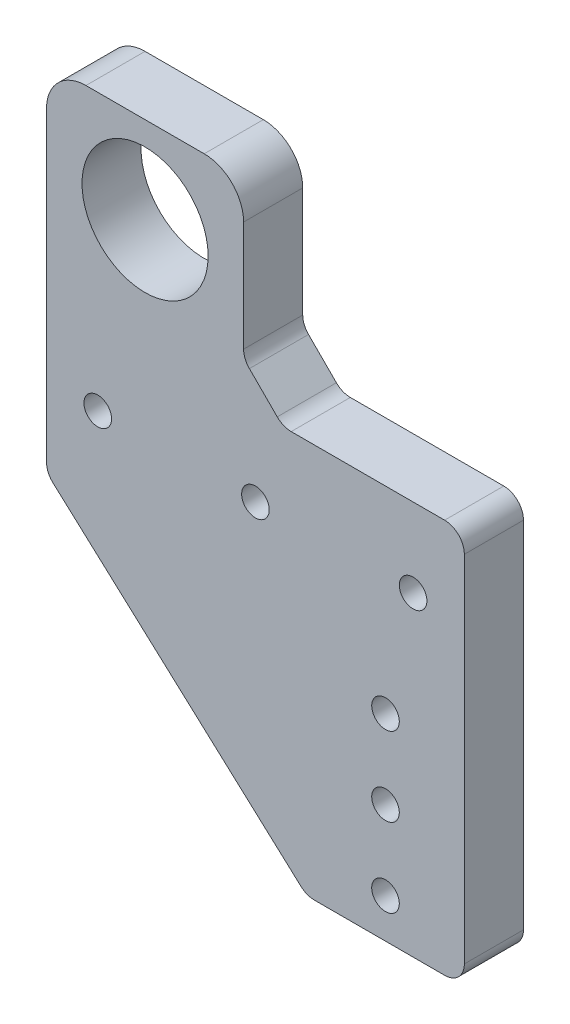
ISO-10303-21;
HEADER;
FILE_DESCRIPTION(('STEP AP214'),'2;1');
FILE_NAME('part.step','',(''),(''),'','','');
FILE_SCHEMA(('AUTOMOTIVE_DESIGN { 1 0 10303 214 1 1 1 1 }'));
ENDSEC;
DATA;
#1=APPLICATION_CONTEXT('core data for automotive mechanical design processes');
#2=APPLICATION_PROTOCOL_DEFINITION('international standard','automotive_design',2000,#1);
#3=PRODUCT_CONTEXT('',#1,'mechanical');
#4=PRODUCT('Part','Part','',(#3));
#5=PRODUCT_RELATED_PRODUCT_CATEGORY('part','',(#4));
#6=PRODUCT_DEFINITION_FORMATION('','',#4);
#7=PRODUCT_DEFINITION_CONTEXT('part definition',#1,'design');
#8=PRODUCT_DEFINITION('design','',#6,#7);
#9=PRODUCT_DEFINITION_SHAPE('','',#8);
#10=(LENGTH_UNIT() NAMED_UNIT(*) SI_UNIT(.MILLI.,.METRE.));
#11=(NAMED_UNIT(*) PLANE_ANGLE_UNIT() SI_UNIT($,.RADIAN.));
#12=(NAMED_UNIT(*) SI_UNIT($,.STERADIAN.) SOLID_ANGLE_UNIT());
#13=UNCERTAINTY_MEASURE_WITH_UNIT(LENGTH_MEASURE(1.E-05),#10,'distance_accuracy_value','');
#14=(GEOMETRIC_REPRESENTATION_CONTEXT(3) GLOBAL_UNCERTAINTY_ASSIGNED_CONTEXT((#13)) GLOBAL_UNIT_ASSIGNED_CONTEXT((#10,
#11,#12)) REPRESENTATION_CONTEXT('',''));
#15=CARTESIAN_POINT('',(0.,0.,0.));
#16=DIRECTION('',(0.,0.,1.));
#17=DIRECTION('',(1.,0.,0.));
#18=AXIS2_PLACEMENT_3D('',#15,#16,#17);
#19=CARTESIAN_POINT('',(-40.,0.,15.));
#20=DIRECTION('',(0.,1.,0.));
#21=DIRECTION('',(0.,0.,1.));
#22=AXIS2_PLACEMENT_3D('',#19,#20,#21);
#23=PLANE('',#22);
#24=DIRECTION('',(1.,0.,0.));
#25=VECTOR('',#24,1.);
#26=CARTESIAN_POINT('',(-40.,0.,0.));
#27=LINE('',#26,#25);
#28=CARTESIAN_POINT('',(-38.0669656263408,0.,0.));
#29=VERTEX_POINT('',#28);
#30=CARTESIAN_POINT('',(-5.,0.,0.));
#31=VERTEX_POINT('',#30);
#32=EDGE_CURVE('E266',#29,#31,#27,.T.);
#33=ORIENTED_EDGE('',*,*,#32,.T.);
#34=DIRECTION('',(0.,0.,-1.));
#35=VECTOR('',#34,1.);
#36=CARTESIAN_POINT('',(-5.,0.,15.));
#37=LINE('',#36,#35);
#38=CARTESIAN_POINT('',(-5.,0.,15.));
#39=VERTEX_POINT('',#38);
#40=EDGE_CURVE('E213',#31,#39,#37,.F.);
#41=ORIENTED_EDGE('',*,*,#40,.T.);
#42=DIRECTION('',(1.,0.,0.));
#43=VECTOR('',#42,1.);
#44=CARTESIAN_POINT('',(-40.,0.,15.));
#45=LINE('',#44,#43);
#46=CARTESIAN_POINT('',(-38.0669656263408,0.,15.));
#47=VERTEX_POINT('',#46);
#48=EDGE_CURVE('E279',#47,#39,#45,.T.);
#49=ORIENTED_EDGE('',*,*,#48,.F.);
#50=DIRECTION('',(0.,0.,-1.));
#51=VECTOR('',#50,1.);
#52=CARTESIAN_POINT('',(-38.0669656263408,0.,15.));
#53=LINE('',#52,#51);
#54=EDGE_CURVE('E210',#47,#29,#53,.T.);
#55=ORIENTED_EDGE('',*,*,#54,.T.);
#56=EDGE_LOOP('',(#33,#41,#49,#55));
#57=FACE_BOUND('',#56,.T.);
#58=ADVANCED_FACE('F33',(#57),#23,.F.);
#59=CARTESIAN_POINT('',(0.,0.,15.));
#60=DIRECTION('',(-1.,0.,0.));
#61=DIRECTION('',(0.,0.,1.));
#62=AXIS2_PLACEMENT_3D('',#59,#60,#61);
#63=PLANE('',#62);
#64=DIRECTION('',(0.,1.,0.));
#65=VECTOR('',#64,1.);
#66=CARTESIAN_POINT('',(0.,0.,0.));
#67=LINE('',#66,#65);
#68=CARTESIAN_POINT('',(0.,5.,0.));
#69=VERTEX_POINT('',#68);
#70=CARTESIAN_POINT('',(0.,95.,0.));
#71=VERTEX_POINT('',#70);
#72=EDGE_CURVE('E269',#69,#71,#67,.T.);
#73=ORIENTED_EDGE('',*,*,#72,.T.);
#74=DIRECTION('',(0.,0.,-1.));
#75=VECTOR('',#74,1.);
#76=CARTESIAN_POINT('',(0.,95.,15.));
#77=LINE('',#76,#75);
#78=CARTESIAN_POINT('',(0.,95.,15.));
#79=VERTEX_POINT('',#78);
#80=EDGE_CURVE('E200',#71,#79,#77,.F.);
#81=ORIENTED_EDGE('',*,*,#80,.T.);
#82=DIRECTION('',(0.,1.,0.));
#83=VECTOR('',#82,1.);
#84=CARTESIAN_POINT('',(0.,0.,15.));
#85=LINE('',#84,#83);
#86=CARTESIAN_POINT('',(0.,5.,15.));
#87=VERTEX_POINT('',#86);
#88=EDGE_CURVE('E262',#87,#79,#85,.T.);
#89=ORIENTED_EDGE('',*,*,#88,.F.);
#90=DIRECTION('',(0.,0.,-1.));
#91=VECTOR('',#90,1.);
#92=CARTESIAN_POINT('',(0.,5.,15.));
#93=LINE('',#92,#91);
#94=EDGE_CURVE('E197',#87,#69,#93,.T.);
#95=ORIENTED_EDGE('',*,*,#94,.T.);
#96=EDGE_LOOP('',(#73,#81,#89,#95));
#97=FACE_BOUND('',#96,.T.);
#98=ADVANCED_FACE('F348',(#97),#63,.F.);
#99=CARTESIAN_POINT('',(0.,100.,15.));
#100=DIRECTION('',(0.,-1.,0.));
#101=DIRECTION('',(0.,0.,-1.));
#102=AXIS2_PLACEMENT_3D('',#99,#100,#101);
#103=PLANE('',#102);
#104=DIRECTION('',(-1.,0.,0.));
#105=VECTOR('',#104,1.);
#106=CARTESIAN_POINT('',(0.,100.,0.));
#107=LINE('',#106,#105);
#108=CARTESIAN_POINT('',(-5.,100.,0.));
#109=VERTEX_POINT('',#108);
#110=CARTESIAN_POINT('',(-43.9289321881345,100.,0.));
#111=VERTEX_POINT('',#110);
#112=EDGE_CURVE('E273',#109,#111,#107,.T.);
#113=ORIENTED_EDGE('',*,*,#112,.T.);
#114=DIRECTION('',(0.,0.,1.));
#115=VECTOR('',#114,1.);
#116=CARTESIAN_POINT('',(-43.9289321881345,100.,15.));
#117=LINE('',#116,#115);
#118=CARTESIAN_POINT('',(-43.9289321881345,100.,15.));
#119=VERTEX_POINT('',#118);
#120=EDGE_CURVE('E185',#111,#119,#117,.T.);
#121=ORIENTED_EDGE('',*,*,#120,.T.);
#122=DIRECTION('',(-1.,0.,0.));
#123=VECTOR('',#122,1.);
#124=CARTESIAN_POINT('',(0.,100.,15.));
#125=LINE('',#124,#123);
#126=CARTESIAN_POINT('',(-5.,100.,15.));
#127=VERTEX_POINT('',#126);
#128=EDGE_CURVE('E257',#127,#119,#125,.T.);
#129=ORIENTED_EDGE('',*,*,#128,.F.);
#130=DIRECTION('',(0.,0.,-1.));
#131=VECTOR('',#130,1.);
#132=CARTESIAN_POINT('',(-5.,100.,15.));
#133=LINE('',#132,#131);
#134=EDGE_CURVE('E182',#127,#109,#133,.T.);
#135=ORIENTED_EDGE('',*,*,#134,.T.);
#136=EDGE_LOOP('',(#113,#121,#129,#135));
#137=FACE_BOUND('',#136,.T.);
#138=ADVANCED_FACE('F354',(#137),#103,.F.);
#139=CARTESIAN_POINT('',(-106.,100.,15.));
#140=DIRECTION('',(1.,0.,0.));
#141=DIRECTION('',(0.,1.,0.));
#142=AXIS2_PLACEMENT_3D('',#139,#140,#141);
#143=PLANE('',#142);
#144=DIRECTION('',(0.,-1.,0.));
#145=VECTOR('',#144,1.);
#146=CARTESIAN_POINT('',(-106.,100.,15.));
#147=LINE('',#146,#145);
#148=CARTESIAN_POINT('',(-106.,140.,15.));
#149=VERTEX_POINT('',#148);
#150=CARTESIAN_POINT('',(-106.,62.2118494305993,15.));
#151=VERTEX_POINT('',#150);
#152=EDGE_CURVE('E252',#149,#151,#147,.T.);
#153=ORIENTED_EDGE('',*,*,#152,.F.);
#154=DIRECTION('',(0.,0.,1.));
#155=VECTOR('',#154,1.);
#156=CARTESIAN_POINT('',(-106.,140.,0.));
#157=LINE('',#156,#155);
#158=CARTESIAN_POINT('',(-106.,140.,0.));
#159=VERTEX_POINT('',#158);
#160=EDGE_CURVE('E56',#149,#159,#157,.F.);
#161=ORIENTED_EDGE('',*,*,#160,.T.);
#162=DIRECTION('',(0.,-1.,0.));
#163=VECTOR('',#162,1.);
#164=CARTESIAN_POINT('',(-106.,100.,0.));
#165=LINE('',#164,#163);
#166=CARTESIAN_POINT('',(-106.,62.2118494305993,0.));
#167=VERTEX_POINT('',#166);
#168=EDGE_CURVE('E241',#159,#167,#165,.T.);
#169=ORIENTED_EDGE('',*,*,#168,.T.);
#170=DIRECTION('',(0.,0.,-1.));
#171=VECTOR('',#170,1.);
#172=CARTESIAN_POINT('',(-106.,62.2118494305993,15.));
#173=LINE('',#172,#171);
#174=EDGE_CURVE('E220',#167,#151,#173,.F.);
#175=ORIENTED_EDGE('',*,*,#174,.T.);
#176=EDGE_LOOP('',(#153,#161,#169,#175));
#177=FACE_BOUND('',#176,.T.);
#178=ADVANCED_FACE('F253',(#177),#143,.F.);
#179=CARTESIAN_POINT('',(-106.,60.,15.));
#180=DIRECTION('',(0.672672793996313,0.739940073395943,0.));
#181=DIRECTION('',(-0.739940073395943,0.672672793996313,0.));
#182=AXIS2_PLACEMENT_3D('',#179,#180,#181);
#183=PLANE('',#182);
#184=DIRECTION('',(0.739940073395943,-0.672672793996313,0.));
#185=VECTOR('',#184,1.);
#186=CARTESIAN_POINT('',(-106.,60.,0.));
#187=LINE('',#186,#185);
#188=CARTESIAN_POINT('',(-104.363363969982,58.5121490636196,0.));
#189=VERTEX_POINT('',#188);
#190=CARTESIAN_POINT('',(-41.4303295963223,1.30029963302029,0.));
#191=VERTEX_POINT('',#190);
#192=EDGE_CURVE('E277',#189,#191,#187,.T.);
#193=ORIENTED_EDGE('',*,*,#192,.T.);
#194=DIRECTION('',(0.,0.,-1.));
#195=VECTOR('',#194,1.);
#196=CARTESIAN_POINT('',(-41.4303295963223,1.30029963302029,15.));
#197=LINE('',#196,#195);
#198=CARTESIAN_POINT('',(-41.4303295963223,1.30029963302029,15.));
#199=VERTEX_POINT('',#198);
#200=EDGE_CURVE('E218',#191,#199,#197,.F.);
#201=ORIENTED_EDGE('',*,*,#200,.T.);
#202=DIRECTION('',(0.739940073395943,-0.672672793996313,0.));
#203=VECTOR('',#202,1.);
#204=CARTESIAN_POINT('',(-106.,60.,15.));
#205=LINE('',#204,#203);
#206=CARTESIAN_POINT('',(-104.363363969982,58.5121490636196,15.));
#207=VERTEX_POINT('',#206);
#208=EDGE_CURVE('E256',#207,#199,#205,.T.);
#209=ORIENTED_EDGE('',*,*,#208,.F.);
#210=DIRECTION('',(0.,0.,-1.));
#211=VECTOR('',#210,1.);
#212=CARTESIAN_POINT('',(-104.363363969982,58.5121490636196,15.));
#213=LINE('',#212,#211);
#214=EDGE_CURVE('E215',#207,#189,#213,.T.);
#215=ORIENTED_EDGE('',*,*,#214,.T.);
#216=EDGE_LOOP('',(#193,#201,#209,#215));
#217=FACE_BOUND('',#216,.T.);
#218=ADVANCED_FACE('F427',(#217),#183,.F.);
#219=CARTESIAN_POINT('',(0.,0.,15.));
#220=DIRECTION('',(0.,0.,1.));
#221=DIRECTION('',(1.,0.,0.));
#222=AXIS2_PLACEMENT_3D('',#219,#220,#221);
#223=PLANE('',#222);
#224=CARTESIAN_POINT('',(-81.,128.,15.));
#225=DIRECTION('',(0.,0.,1.));
#226=DIRECTION('',(1.,0.,0.));
#227=AXIS2_PLACEMENT_3D('',#224,#225,#226);
#228=CIRCLE('',#227,16.);
#229=CARTESIAN_POINT('',(-65.,128.,15.));
#230=VERTEX_POINT('',#229);
#231=EDGE_CURVE('E169',#230,#230,#228,.T.);
#232=ORIENTED_EDGE('',*,*,#231,.F.);
#233=EDGE_LOOP('',(#232));
#234=FACE_BOUND('',#233,.T.);
#235=CARTESIAN_POINT('',(-20.,30.,15.));
#236=DIRECTION('',(0.,0.,1.));
#237=DIRECTION('',(1.,0.,0.));
#238=AXIS2_PLACEMENT_3D('',#235,#236,#237);
#239=CIRCLE('',#238,3.5);
#240=CARTESIAN_POINT('',(-16.5,30.,15.));
#241=VERTEX_POINT('',#240);
#242=EDGE_CURVE('E294',#241,#241,#239,.T.);
#243=ORIENTED_EDGE('',*,*,#242,.F.);
#244=EDGE_LOOP('',(#243));
#245=FACE_BOUND('',#244,.T.);
#246=CARTESIAN_POINT('',(-20.,50.,15.));
#247=DIRECTION('',(0.,0.,1.));
#248=DIRECTION('',(1.,0.,0.));
#249=AXIS2_PLACEMENT_3D('',#246,#247,#248);
#250=CIRCLE('',#249,3.5);
#251=CARTESIAN_POINT('',(-16.5,50.,15.));
#252=VERTEX_POINT('',#251);
#253=EDGE_CURVE('E297',#252,#252,#250,.T.);
#254=ORIENTED_EDGE('',*,*,#253,.F.);
#255=EDGE_LOOP('',(#254));
#256=FACE_BOUND('',#255,.T.);
#257=CARTESIAN_POINT('',(-13.,80.,15.));
#258=DIRECTION('',(0.,0.,1.));
#259=DIRECTION('',(1.,0.,0.));
#260=AXIS2_PLACEMENT_3D('',#257,#258,#259);
#261=CIRCLE('',#260,3.50000000000001);
#262=CARTESIAN_POINT('',(-9.49999999999998,80.,15.));
#263=VERTEX_POINT('',#262);
#264=EDGE_CURVE('E300',#263,#263,#261,.T.);
#265=ORIENTED_EDGE('',*,*,#264,.F.);
#266=EDGE_LOOP('',(#265));
#267=FACE_BOUND('',#266,.T.);
#268=CARTESIAN_POINT('',(-93.,80.,15.));
#269=DIRECTION('',(0.,0.,1.));
#270=DIRECTION('',(1.,0.,0.));
#271=AXIS2_PLACEMENT_3D('',#268,#269,#270);
#272=CIRCLE('',#271,3.50000000000001);
#273=CARTESIAN_POINT('',(-89.5,80.,15.));
#274=VERTEX_POINT('',#273);
#275=EDGE_CURVE('E303',#274,#274,#272,.T.);
#276=ORIENTED_EDGE('',*,*,#275,.F.);
#277=EDGE_LOOP('',(#276));
#278=FACE_BOUND('',#277,.T.);
#279=CARTESIAN_POINT('',(-53.,80.,15.));
#280=DIRECTION('',(0.,0.,1.));
#281=DIRECTION('',(1.,0.,0.));
#282=AXIS2_PLACEMENT_3D('',#279,#280,#281);
#283=CIRCLE('',#282,3.5);
#284=CARTESIAN_POINT('',(-49.5,80.,15.));
#285=VERTEX_POINT('',#284);
#286=EDGE_CURVE('E306',#285,#285,#283,.T.);
#287=ORIENTED_EDGE('',*,*,#286,.F.);
#288=EDGE_LOOP('',(#287));
#289=FACE_BOUND('',#288,.T.);
#290=CARTESIAN_POINT('',(-20.,10.,15.));
#291=DIRECTION('',(0.,0.,1.));
#292=DIRECTION('',(1.,0.,0.));
#293=AXIS2_PLACEMENT_3D('',#290,#291,#292);
#294=CIRCLE('',#293,3.5);
#295=CARTESIAN_POINT('',(-16.5,10.,15.));
#296=VERTEX_POINT('',#295);
#297=EDGE_CURVE('E270',#296,#296,#294,.T.);
#298=ORIENTED_EDGE('',*,*,#297,.F.);
#299=EDGE_LOOP('',(#298));
#300=FACE_BOUND('',#299,.T.);
#301=DIRECTION('',(-1.,0.,0.));
#302=VECTOR('',#301,1.);
#303=CARTESIAN_POINT('',(-106.,150.,15.));
#304=LINE('',#303,#302);
#305=CARTESIAN_POINT('',(-66.,150.,15.));
#306=VERTEX_POINT('',#305);
#307=CARTESIAN_POINT('',(-96.,150.,15.));
#308=VERTEX_POINT('',#307);
#309=EDGE_CURVE('E168',#306,#308,#304,.T.);
#310=ORIENTED_EDGE('',*,*,#309,.T.);
#311=CARTESIAN_POINT('',(-96.,140.,15.));
#312=DIRECTION('',(0.,0.,1.));
#313=DIRECTION('',(1.,0.,0.));
#314=AXIS2_PLACEMENT_3D('',#311,#312,#313);
#315=CIRCLE('',#314,10.);
#316=EDGE_CURVE('E234',#308,#149,#315,.T.);
#317=ORIENTED_EDGE('',*,*,#316,.T.);
#318=ORIENTED_EDGE('',*,*,#152,.T.);
#319=CARTESIAN_POINT('',(-101.,62.2118494305993,15.));
#320=DIRECTION('',(0.,0.,1.));
#321=DIRECTION('',(1.,0.,0.));
#322=AXIS2_PLACEMENT_3D('',#319,#320,#321);
#323=CIRCLE('',#322,5.);
#324=EDGE_CURVE('E202',#151,#207,#323,.T.);
#325=ORIENTED_EDGE('',*,*,#324,.T.);
#326=ORIENTED_EDGE('',*,*,#208,.T.);
#327=CARTESIAN_POINT('',(-38.0669656263408,5.,15.));
#328=DIRECTION('',(0.,0.,1.));
#329=DIRECTION('',(1.,0.,0.));
#330=AXIS2_PLACEMENT_3D('',#327,#328,#329);
#331=CIRCLE('',#330,5.);
#332=EDGE_CURVE('E204',#199,#47,#331,.T.);
#333=ORIENTED_EDGE('',*,*,#332,.T.);
#334=ORIENTED_EDGE('',*,*,#48,.T.);
#335=CARTESIAN_POINT('',(-5.,5.,15.));
#336=DIRECTION('',(0.,0.,1.));
#337=DIRECTION('',(1.,0.,0.));
#338=AXIS2_PLACEMENT_3D('',#335,#336,#337);
#339=CIRCLE('',#338,5.);
#340=EDGE_CURVE('E206',#39,#87,#339,.T.);
#341=ORIENTED_EDGE('',*,*,#340,.T.);
#342=ORIENTED_EDGE('',*,*,#88,.T.);
#343=CARTESIAN_POINT('',(-5.,95.,15.));
#344=DIRECTION('',(0.,0.,1.));
#345=DIRECTION('',(1.,0.,0.));
#346=AXIS2_PLACEMENT_3D('',#343,#344,#345);
#347=CIRCLE('',#346,5.);
#348=EDGE_CURVE('E208',#79,#127,#347,.T.);
#349=ORIENTED_EDGE('',*,*,#348,.T.);
#350=ORIENTED_EDGE('',*,*,#128,.T.);
#351=CARTESIAN_POINT('',(-43.9289321881345,105.,15.));
#352=DIRECTION('',(0.,0.,1.));
#353=DIRECTION('',(1.,0.,0.));
#354=AXIS2_PLACEMENT_3D('',#351,#352,#353);
#355=CIRCLE('',#354,5.);
#356=CARTESIAN_POINT('',(-47.4644660940672,101.464466094067,15.));
#357=VERTEX_POINT('',#356);
#358=EDGE_CURVE('E160',#119,#357,#355,.F.);
#359=ORIENTED_EDGE('',*,*,#358,.T.);
#360=DIRECTION('',(-0.707106781186551,0.707106781186544,0.));
#361=VECTOR('',#360,1.);
#362=CARTESIAN_POINT('',(-45.9999999999999,100.,15.));
#363=LINE('',#362,#361);
#364=CARTESIAN_POINT('',(-54.5355339059327,108.535533905933,15.));
#365=VERTEX_POINT('',#364);
#366=EDGE_CURVE('E156',#357,#365,#363,.T.);
#367=ORIENTED_EDGE('',*,*,#366,.T.);
#368=CARTESIAN_POINT('',(-51.,112.071067811865,15.));
#369=DIRECTION('',(0.,0.,1.));
#370=DIRECTION('',(1.,0.,0.));
#371=AXIS2_PLACEMENT_3D('',#368,#369,#370);
#372=CIRCLE('',#371,5.);
#373=CARTESIAN_POINT('',(-56.,112.071067811865,15.));
#374=VERTEX_POINT('',#373);
#375=EDGE_CURVE('E150',#365,#374,#372,.F.);
#376=ORIENTED_EDGE('',*,*,#375,.T.);
#377=DIRECTION('',(0.,1.,0.));
#378=VECTOR('',#377,1.);
#379=CARTESIAN_POINT('',(-56.,100.,15.));
#380=LINE('',#379,#378);
#381=CARTESIAN_POINT('',(-56.,140.,15.));
#382=VERTEX_POINT('',#381);
#383=EDGE_CURVE('E154',#374,#382,#380,.T.);
#384=ORIENTED_EDGE('',*,*,#383,.T.);
#385=CARTESIAN_POINT('',(-66.,140.,15.));
#386=DIRECTION('',(0.,0.,1.));
#387=DIRECTION('',(1.,0.,0.));
#388=AXIS2_PLACEMENT_3D('',#385,#386,#387);
#389=CIRCLE('',#388,10.);
#390=EDGE_CURVE('E232',#382,#306,#389,.T.);
#391=ORIENTED_EDGE('',*,*,#390,.T.);
#392=EDGE_LOOP('',(#310,#317,#318,#325,#326,#333,#334,#341,#342,#349,#350,#359,#367,#376,#384,#391));
#393=FACE_BOUND('',#392,.T.);
#394=ADVANCED_FACE('F153',(#234,#245,#256,#267,#278,#289,#300,#393),#223,.T.);
#395=CARTESIAN_POINT('',(0.,0.,0.));
#396=DIRECTION('',(0.,0.,1.));
#397=DIRECTION('',(1.,0.,0.));
#398=AXIS2_PLACEMENT_3D('',#395,#396,#397);
#399=PLANE('',#398);
#400=CARTESIAN_POINT('',(-81.,128.,0.));
#401=DIRECTION('',(0.,0.,1.));
#402=DIRECTION('',(1.,0.,0.));
#403=AXIS2_PLACEMENT_3D('',#400,#401,#402);
#404=CIRCLE('',#403,16.);
#405=CARTESIAN_POINT('',(-65.,128.,0.));
#406=VERTEX_POINT('',#405);
#407=EDGE_CURVE('E327',#406,#406,#404,.T.);
#408=ORIENTED_EDGE('',*,*,#407,.T.);
#409=EDGE_LOOP('',(#408));
#410=FACE_BOUND('',#409,.T.);
#411=CARTESIAN_POINT('',(-20.,30.,0.));
#412=DIRECTION('',(0.,0.,1.));
#413=DIRECTION('',(1.,0.,0.));
#414=AXIS2_PLACEMENT_3D('',#411,#412,#413);
#415=CIRCLE('',#414,3.5);
#416=CARTESIAN_POINT('',(-16.5,30.,0.));
#417=VERTEX_POINT('',#416);
#418=EDGE_CURVE('E309',#417,#417,#415,.T.);
#419=ORIENTED_EDGE('',*,*,#418,.T.);
#420=EDGE_LOOP('',(#419));
#421=FACE_BOUND('',#420,.T.);
#422=CARTESIAN_POINT('',(-20.,50.,0.));
#423=DIRECTION('',(0.,0.,1.));
#424=DIRECTION('',(1.,0.,0.));
#425=AXIS2_PLACEMENT_3D('',#422,#423,#424);
#426=CIRCLE('',#425,3.5);
#427=CARTESIAN_POINT('',(-16.5,50.,0.));
#428=VERTEX_POINT('',#427);
#429=EDGE_CURVE('E313',#428,#428,#426,.T.);
#430=ORIENTED_EDGE('',*,*,#429,.T.);
#431=EDGE_LOOP('',(#430));
#432=FACE_BOUND('',#431,.T.);
#433=CARTESIAN_POINT('',(-13.,80.,0.));
#434=DIRECTION('',(0.,0.,1.));
#435=DIRECTION('',(-1.,0.,0.));
#436=AXIS2_PLACEMENT_3D('',#433,#434,#435);
#437=CIRCLE('',#436,3.50000000000001);
#438=CARTESIAN_POINT('',(-16.5,80.,0.));
#439=VERTEX_POINT('',#438);
#440=EDGE_CURVE('E248',#439,#439,#437,.T.);
#441=ORIENTED_EDGE('',*,*,#440,.T.);
#442=EDGE_LOOP('',(#441));
#443=FACE_BOUND('',#442,.T.);
#444=CARTESIAN_POINT('',(-93.,80.,0.));
#445=DIRECTION('',(0.,0.,1.));
#446=DIRECTION('',(1.,0.,0.));
#447=AXIS2_PLACEMENT_3D('',#444,#445,#446);
#448=CIRCLE('',#447,3.50000000000001);
#449=CARTESIAN_POINT('',(-89.5,80.,0.));
#450=VERTEX_POINT('',#449);
#451=EDGE_CURVE('E314',#450,#450,#448,.T.);
#452=ORIENTED_EDGE('',*,*,#451,.T.);
#453=EDGE_LOOP('',(#452));
#454=FACE_BOUND('',#453,.T.);
#455=CARTESIAN_POINT('',(-53.,80.,0.));
#456=DIRECTION('',(0.,0.,1.));
#457=DIRECTION('',(1.,0.,0.));
#458=AXIS2_PLACEMENT_3D('',#455,#456,#457);
#459=CIRCLE('',#458,3.5);
#460=CARTESIAN_POINT('',(-49.5,80.,0.));
#461=VERTEX_POINT('',#460);
#462=EDGE_CURVE('E310',#461,#461,#459,.T.);
#463=ORIENTED_EDGE('',*,*,#462,.T.);
#464=EDGE_LOOP('',(#463));
#465=FACE_BOUND('',#464,.T.);
#466=CARTESIAN_POINT('',(-20.,10.,0.));
#467=DIRECTION('',(0.,0.,1.));
#468=DIRECTION('',(1.,0.,0.));
#469=AXIS2_PLACEMENT_3D('',#466,#467,#468);
#470=CIRCLE('',#469,3.5);
#471=CARTESIAN_POINT('',(-16.5,10.,0.));
#472=VERTEX_POINT('',#471);
#473=EDGE_CURVE('E291',#472,#472,#470,.T.);
#474=ORIENTED_EDGE('',*,*,#473,.T.);
#475=EDGE_LOOP('',(#474));
#476=FACE_BOUND('',#475,.T.);
#477=ORIENTED_EDGE('',*,*,#168,.F.);
#478=CARTESIAN_POINT('',(-96.,140.,0.));
#479=DIRECTION('',(0.,0.,1.));
#480=DIRECTION('',(1.,0.,0.));
#481=AXIS2_PLACEMENT_3D('',#478,#479,#480);
#482=CIRCLE('',#481,10.);
#483=CARTESIAN_POINT('',(-96.,150.,0.));
#484=VERTEX_POINT('',#483);
#485=EDGE_CURVE('E41',#159,#484,#482,.F.);
#486=ORIENTED_EDGE('',*,*,#485,.T.);
#487=DIRECTION('',(-1.,0.,0.));
#488=VECTOR('',#487,1.);
#489=CARTESIAN_POINT('',(-106.,150.,0.));
#490=LINE('',#489,#488);
#491=CARTESIAN_POINT('',(-66.,150.,0.));
#492=VERTEX_POINT('',#491);
#493=EDGE_CURVE('E240',#492,#484,#490,.T.);
#494=ORIENTED_EDGE('',*,*,#493,.F.);
#495=CARTESIAN_POINT('',(-66.,140.,0.));
#496=DIRECTION('',(0.,0.,1.));
#497=DIRECTION('',(1.,0.,0.));
#498=AXIS2_PLACEMENT_3D('',#495,#496,#497);
#499=CIRCLE('',#498,10.);
#500=CARTESIAN_POINT('',(-56.,140.,0.));
#501=VERTEX_POINT('',#500);
#502=EDGE_CURVE('E48',#492,#501,#499,.F.);
#503=ORIENTED_EDGE('',*,*,#502,.T.);
#504=DIRECTION('',(0.,1.,0.));
#505=VECTOR('',#504,1.);
#506=CARTESIAN_POINT('',(-56.,100.,0.));
#507=LINE('',#506,#505);
#508=CARTESIAN_POINT('',(-56.,112.071067811865,0.));
#509=VERTEX_POINT('',#508);
#510=EDGE_CURVE('E249',#509,#501,#507,.T.);
#511=ORIENTED_EDGE('',*,*,#510,.F.);
#512=CARTESIAN_POINT('',(-51.,112.071067811865,0.));
#513=DIRECTION('',(0.,0.,1.));
#514=DIRECTION('',(1.,0.,0.));
#515=AXIS2_PLACEMENT_3D('',#512,#513,#514);
#516=CIRCLE('',#515,5.);
#517=CARTESIAN_POINT('',(-54.5355339059327,108.535533905933,0.));
#518=VERTEX_POINT('',#517);
#519=EDGE_CURVE('E161',#509,#518,#516,.T.);
#520=ORIENTED_EDGE('',*,*,#519,.T.);
#521=DIRECTION('',(0.707106781186551,-0.707106781186544,0.));
#522=VECTOR('',#521,1.);
#523=CARTESIAN_POINT('',(27.0000000000003,27.0000000000006,0.));
#524=LINE('',#523,#522);
#525=CARTESIAN_POINT('',(-47.4644660940672,101.464466094067,0.));
#526=VERTEX_POINT('',#525);
#527=EDGE_CURVE('E173',#518,#526,#524,.T.);
#528=ORIENTED_EDGE('',*,*,#527,.T.);
#529=CARTESIAN_POINT('',(-43.9289321881345,105.,0.));
#530=DIRECTION('',(0.,0.,1.));
#531=DIRECTION('',(1.,0.,0.));
#532=AXIS2_PLACEMENT_3D('',#529,#530,#531);
#533=CIRCLE('',#532,5.);
#534=EDGE_CURVE('E225',#526,#111,#533,.T.);
#535=ORIENTED_EDGE('',*,*,#534,.T.);
#536=ORIENTED_EDGE('',*,*,#112,.F.);
#537=CARTESIAN_POINT('',(-5.,95.,0.));
#538=DIRECTION('',(0.,0.,1.));
#539=DIRECTION('',(1.,0.,0.));
#540=AXIS2_PLACEMENT_3D('',#537,#538,#539);
#541=CIRCLE('',#540,5.);
#542=EDGE_CURVE('E195',#109,#71,#541,.F.);
#543=ORIENTED_EDGE('',*,*,#542,.T.);
#544=ORIENTED_EDGE('',*,*,#72,.F.);
#545=CARTESIAN_POINT('',(-5.,5.,0.));
#546=DIRECTION('',(0.,0.,1.));
#547=DIRECTION('',(1.,0.,0.));
#548=AXIS2_PLACEMENT_3D('',#545,#546,#547);
#549=CIRCLE('',#548,5.);
#550=EDGE_CURVE('E193',#69,#31,#549,.F.);
#551=ORIENTED_EDGE('',*,*,#550,.T.);
#552=ORIENTED_EDGE('',*,*,#32,.F.);
#553=CARTESIAN_POINT('',(-38.0669656263408,5.,0.));
#554=DIRECTION('',(0.,0.,1.));
#555=DIRECTION('',(1.,0.,0.));
#556=AXIS2_PLACEMENT_3D('',#553,#554,#555);
#557=CIRCLE('',#556,5.);
#558=EDGE_CURVE('E191',#29,#191,#557,.F.);
#559=ORIENTED_EDGE('',*,*,#558,.T.);
#560=ORIENTED_EDGE('',*,*,#192,.F.);
#561=CARTESIAN_POINT('',(-101.,62.2118494305993,0.));
#562=DIRECTION('',(0.,0.,1.));
#563=DIRECTION('',(1.,0.,0.));
#564=AXIS2_PLACEMENT_3D('',#561,#562,#563);
#565=CIRCLE('',#564,5.);
#566=EDGE_CURVE('E188',#189,#167,#565,.F.);
#567=ORIENTED_EDGE('',*,*,#566,.T.);
#568=EDGE_LOOP('',(#477,#486,#494,#503,#511,#520,#528,#535,#536,#543,#544,#551,#552,#559,#560,#567));
#569=FACE_BOUND('',#568,.T.);
#570=ADVANCED_FACE('F239',(#410,#421,#432,#443,#454,#465,#476,#569),#399,.F.);
#571=CARTESIAN_POINT('',(-20.,10.,0.));
#572=DIRECTION('',(0.,0.,1.));
#573=DIRECTION('',(1.,0.,0.));
#574=AXIS2_PLACEMENT_3D('',#571,#572,#573);
#575=CYLINDRICAL_SURFACE('',#574,3.5);
#576=ORIENTED_EDGE('',*,*,#297,.T.);
#577=EDGE_LOOP('',(#576));
#578=FACE_BOUND('',#577,.T.);
#579=ORIENTED_EDGE('',*,*,#473,.F.);
#580=EDGE_LOOP('',(#579));
#581=FACE_BOUND('',#580,.T.);
#582=ADVANCED_FACE('F416',(#578,#581),#575,.F.);
#583=CARTESIAN_POINT('',(-53.,80.,0.));
#584=DIRECTION('',(0.,0.,1.));
#585=DIRECTION('',(1.,0.,0.));
#586=AXIS2_PLACEMENT_3D('',#583,#584,#585);
#587=CYLINDRICAL_SURFACE('',#586,3.5);
#588=ORIENTED_EDGE('',*,*,#286,.T.);
#589=EDGE_LOOP('',(#588));
#590=FACE_BOUND('',#589,.T.);
#591=ORIENTED_EDGE('',*,*,#462,.F.);
#592=EDGE_LOOP('',(#591));
#593=FACE_BOUND('',#592,.T.);
#594=ADVANCED_FACE('F546',(#590,#593),#587,.F.);
#595=CARTESIAN_POINT('',(-93.,80.,0.));
#596=DIRECTION('',(0.,0.,1.));
#597=DIRECTION('',(1.,0.,0.));
#598=AXIS2_PLACEMENT_3D('',#595,#596,#597);
#599=CYLINDRICAL_SURFACE('',#598,3.50000000000001);
#600=ORIENTED_EDGE('',*,*,#275,.T.);
#601=EDGE_LOOP('',(#600));
#602=FACE_BOUND('',#601,.T.);
#603=ORIENTED_EDGE('',*,*,#451,.F.);
#604=EDGE_LOOP('',(#603));
#605=FACE_BOUND('',#604,.T.);
#606=ADVANCED_FACE('F536',(#602,#605),#599,.F.);
#607=CARTESIAN_POINT('',(-13.,80.,0.));
#608=DIRECTION('',(0.,0.,1.));
#609=DIRECTION('',(1.,0.,0.));
#610=AXIS2_PLACEMENT_3D('',#607,#608,#609);
#611=CYLINDRICAL_SURFACE('',#610,3.50000000000001);
#612=ORIENTED_EDGE('',*,*,#264,.T.);
#613=EDGE_LOOP('',(#612));
#614=FACE_BOUND('',#613,.T.);
#615=ORIENTED_EDGE('',*,*,#440,.F.);
#616=EDGE_LOOP('',(#615));
#617=FACE_BOUND('',#616,.T.);
#618=ADVANCED_FACE('F526',(#614,#617),#611,.F.);
#619=CARTESIAN_POINT('',(-20.,50.,0.));
#620=DIRECTION('',(0.,0.,1.));
#621=DIRECTION('',(1.,0.,0.));
#622=AXIS2_PLACEMENT_3D('',#619,#620,#621);
#623=CYLINDRICAL_SURFACE('',#622,3.5);
#624=ORIENTED_EDGE('',*,*,#253,.T.);
#625=EDGE_LOOP('',(#624));
#626=FACE_BOUND('',#625,.T.);
#627=ORIENTED_EDGE('',*,*,#429,.F.);
#628=EDGE_LOOP('',(#627));
#629=FACE_BOUND('',#628,.T.);
#630=ADVANCED_FACE('F516',(#626,#629),#623,.F.);
#631=CARTESIAN_POINT('',(-20.,30.,0.));
#632=DIRECTION('',(0.,0.,1.));
#633=DIRECTION('',(1.,0.,0.));
#634=AXIS2_PLACEMENT_3D('',#631,#632,#633);
#635=CYLINDRICAL_SURFACE('',#634,3.5);
#636=ORIENTED_EDGE('',*,*,#242,.T.);
#637=EDGE_LOOP('',(#636));
#638=FACE_BOUND('',#637,.T.);
#639=ORIENTED_EDGE('',*,*,#418,.F.);
#640=EDGE_LOOP('',(#639));
#641=FACE_BOUND('',#640,.T.);
#642=ADVANCED_FACE('F407',(#638,#641),#635,.F.);
#643=CARTESIAN_POINT('',(-106.,150.,0.));
#644=DIRECTION('',(0.,1.,0.));
#645=DIRECTION('',(0.,0.,1.));
#646=AXIS2_PLACEMENT_3D('',#643,#644,#645);
#647=PLANE('',#646);
#648=ORIENTED_EDGE('',*,*,#493,.T.);
#649=DIRECTION('',(0.,0.,1.));
#650=VECTOR('',#649,1.);
#651=CARTESIAN_POINT('',(-96.,150.,15.));
#652=LINE('',#651,#650);
#653=EDGE_CURVE('E229',#484,#308,#652,.T.);
#654=ORIENTED_EDGE('',*,*,#653,.T.);
#655=ORIENTED_EDGE('',*,*,#309,.F.);
#656=DIRECTION('',(0.,0.,1.));
#657=VECTOR('',#656,1.);
#658=CARTESIAN_POINT('',(-66.,150.,0.));
#659=LINE('',#658,#657);
#660=EDGE_CURVE('E227',#306,#492,#659,.F.);
#661=ORIENTED_EDGE('',*,*,#660,.T.);
#662=EDGE_LOOP('',(#648,#654,#655,#661));
#663=FACE_BOUND('',#662,.T.);
#664=ADVANCED_FACE('F245',(#663),#647,.T.);
#665=CARTESIAN_POINT('',(-56.,100.,0.));
#666=DIRECTION('',(1.,0.,0.));
#667=DIRECTION('',(0.,0.,-1.));
#668=AXIS2_PLACEMENT_3D('',#665,#666,#667);
#669=PLANE('',#668);
#670=ORIENTED_EDGE('',*,*,#510,.T.);
#671=DIRECTION('',(0.,0.,1.));
#672=VECTOR('',#671,1.);
#673=CARTESIAN_POINT('',(-56.,140.,0.));
#674=LINE('',#673,#672);
#675=EDGE_CURVE('E11',#501,#382,#674,.T.);
#676=ORIENTED_EDGE('',*,*,#675,.T.);
#677=ORIENTED_EDGE('',*,*,#383,.F.);
#678=DIRECTION('',(0.,0.,-1.));
#679=VECTOR('',#678,1.);
#680=CARTESIAN_POINT('',(-56.,112.071067811865,0.));
#681=LINE('',#680,#679);
#682=EDGE_CURVE('E166',#374,#509,#681,.T.);
#683=ORIENTED_EDGE('',*,*,#682,.T.);
#684=EDGE_LOOP('',(#670,#676,#677,#683));
#685=FACE_BOUND('',#684,.T.);
#686=ADVANCED_FACE('F165',(#685),#669,.T.);
#687=CARTESIAN_POINT('',(-45.9999999999999,100.,15.));
#688=DIRECTION('',(-0.707106781186544,-0.707106781186551,0.));
#689=DIRECTION('',(0.,0.,1.));
#690=AXIS2_PLACEMENT_3D('',#687,#688,#689);
#691=PLANE('',#690);
#692=ORIENTED_EDGE('',*,*,#527,.F.);
#693=DIRECTION('',(0.,0.,-1.));
#694=VECTOR('',#693,1.);
#695=CARTESIAN_POINT('',(-54.5355339059327,108.535533905933,15.));
#696=LINE('',#695,#694);
#697=EDGE_CURVE('E175',#518,#365,#696,.F.);
#698=ORIENTED_EDGE('',*,*,#697,.T.);
#699=ORIENTED_EDGE('',*,*,#366,.F.);
#700=DIRECTION('',(0.,0.,1.));
#701=VECTOR('',#700,1.);
#702=CARTESIAN_POINT('',(-47.4644660940672,101.464466094067,0.));
#703=LINE('',#702,#701);
#704=EDGE_CURVE('E172',#357,#526,#703,.F.);
#705=ORIENTED_EDGE('',*,*,#704,.T.);
#706=EDGE_LOOP('',(#692,#698,#699,#705));
#707=FACE_BOUND('',#706,.T.);
#708=ADVANCED_FACE('F335',(#707),#691,.F.);
#709=CARTESIAN_POINT('',(-81.,128.,0.));
#710=DIRECTION('',(0.,0.,1.));
#711=DIRECTION('',(1.,0.,0.));
#712=AXIS2_PLACEMENT_3D('',#709,#710,#711);
#713=CYLINDRICAL_SURFACE('',#712,16.);
#714=ORIENTED_EDGE('',*,*,#231,.T.);
#715=EDGE_LOOP('',(#714));
#716=FACE_BOUND('',#715,.T.);
#717=ORIENTED_EDGE('',*,*,#407,.F.);
#718=EDGE_LOOP('',(#717));
#719=FACE_BOUND('',#718,.T.);
#720=ADVANCED_FACE('F333',(#716,#719),#713,.F.);
#721=CARTESIAN_POINT('',(-51.,112.071067811865,0.));
#722=DIRECTION('',(0.,0.,-1.));
#723=DIRECTION('',(-1.,0.,0.));
#724=AXIS2_PLACEMENT_3D('',#721,#722,#723);
#725=CYLINDRICAL_SURFACE('',#724,5.);
#726=ORIENTED_EDGE('',*,*,#375,.F.);
#727=ORIENTED_EDGE('',*,*,#697,.F.);
#728=ORIENTED_EDGE('',*,*,#519,.F.);
#729=ORIENTED_EDGE('',*,*,#682,.F.);
#730=EDGE_LOOP('',(#726,#727,#728,#729));
#731=FACE_BOUND('',#730,.T.);
#732=ADVANCED_FACE('F171',(#731),#725,.F.);
#733=CARTESIAN_POINT('',(-43.9289321881345,105.,15.));
#734=DIRECTION('',(0.,0.,-1.));
#735=DIRECTION('',(-1.,0.,0.));
#736=AXIS2_PLACEMENT_3D('',#733,#734,#735);
#737=CYLINDRICAL_SURFACE('',#736,5.);
#738=ORIENTED_EDGE('',*,*,#534,.F.);
#739=ORIENTED_EDGE('',*,*,#704,.F.);
#740=ORIENTED_EDGE('',*,*,#358,.F.);
#741=ORIENTED_EDGE('',*,*,#120,.F.);
#742=EDGE_LOOP('',(#738,#739,#740,#741));
#743=FACE_BOUND('',#742,.T.);
#744=ADVANCED_FACE('F342',(#743),#737,.F.);
#745=CARTESIAN_POINT('',(-5.,95.,15.));
#746=DIRECTION('',(0.,0.,-1.));
#747=DIRECTION('',(-1.,0.,0.));
#748=AXIS2_PLACEMENT_3D('',#745,#746,#747);
#749=CYLINDRICAL_SURFACE('',#748,5.);
#750=ORIENTED_EDGE('',*,*,#348,.F.);
#751=ORIENTED_EDGE('',*,*,#80,.F.);
#752=ORIENTED_EDGE('',*,*,#542,.F.);
#753=ORIENTED_EDGE('',*,*,#134,.F.);
#754=EDGE_LOOP('',(#750,#751,#752,#753));
#755=FACE_BOUND('',#754,.T.);
#756=ADVANCED_FACE('F361',(#755),#749,.T.);
#757=CARTESIAN_POINT('',(-5.,5.,15.));
#758=DIRECTION('',(0.,0.,-1.));
#759=DIRECTION('',(-1.,0.,0.));
#760=AXIS2_PLACEMENT_3D('',#757,#758,#759);
#761=CYLINDRICAL_SURFACE('',#760,5.);
#762=ORIENTED_EDGE('',*,*,#340,.F.);
#763=ORIENTED_EDGE('',*,*,#40,.F.);
#764=ORIENTED_EDGE('',*,*,#550,.F.);
#765=ORIENTED_EDGE('',*,*,#94,.F.);
#766=EDGE_LOOP('',(#762,#763,#764,#765));
#767=FACE_BOUND('',#766,.T.);
#768=ADVANCED_FACE('F365',(#767),#761,.T.);
#769=CARTESIAN_POINT('',(-38.0669656263408,5.,15.));
#770=DIRECTION('',(0.,0.,-1.));
#771=DIRECTION('',(-1.,0.,0.));
#772=AXIS2_PLACEMENT_3D('',#769,#770,#771);
#773=CYLINDRICAL_SURFACE('',#772,5.);
#774=ORIENTED_EDGE('',*,*,#332,.F.);
#775=ORIENTED_EDGE('',*,*,#200,.F.);
#776=ORIENTED_EDGE('',*,*,#558,.F.);
#777=ORIENTED_EDGE('',*,*,#54,.F.);
#778=EDGE_LOOP('',(#774,#775,#776,#777));
#779=FACE_BOUND('',#778,.T.);
#780=ADVANCED_FACE('F369',(#779),#773,.T.);
#781=CARTESIAN_POINT('',(-101.,62.2118494305993,15.));
#782=DIRECTION('',(0.,0.,-1.));
#783=DIRECTION('',(-1.,0.,0.));
#784=AXIS2_PLACEMENT_3D('',#781,#782,#783);
#785=CYLINDRICAL_SURFACE('',#784,5.);
#786=ORIENTED_EDGE('',*,*,#324,.F.);
#787=ORIENTED_EDGE('',*,*,#174,.F.);
#788=ORIENTED_EDGE('',*,*,#566,.F.);
#789=ORIENTED_EDGE('',*,*,#214,.F.);
#790=EDGE_LOOP('',(#786,#787,#788,#789));
#791=FACE_BOUND('',#790,.T.);
#792=ADVANCED_FACE('F373',(#791),#785,.T.);
#793=CARTESIAN_POINT('',(-96.,140.,0.));
#794=DIRECTION('',(0.,0.,-1.));
#795=DIRECTION('',(-1.,0.,0.));
#796=AXIS2_PLACEMENT_3D('',#793,#794,#795);
#797=CYLINDRICAL_SURFACE('',#796,10.);
#798=ORIENTED_EDGE('',*,*,#485,.F.);
#799=ORIENTED_EDGE('',*,*,#160,.F.);
#800=ORIENTED_EDGE('',*,*,#316,.F.);
#801=ORIENTED_EDGE('',*,*,#653,.F.);
#802=EDGE_LOOP('',(#798,#799,#800,#801));
#803=FACE_BOUND('',#802,.T.);
#804=ADVANCED_FACE('F251',(#803),#797,.T.);
#805=CARTESIAN_POINT('',(-66.,140.,0.));
#806=DIRECTION('',(0.,0.,1.));
#807=DIRECTION('',(1.,0.,0.));
#808=AXIS2_PLACEMENT_3D('',#805,#806,#807);
#809=CYLINDRICAL_SURFACE('',#808,10.);
#810=ORIENTED_EDGE('',*,*,#502,.F.);
#811=ORIENTED_EDGE('',*,*,#660,.F.);
#812=ORIENTED_EDGE('',*,*,#390,.F.);
#813=ORIENTED_EDGE('',*,*,#675,.F.);
#814=EDGE_LOOP('',(#810,#811,#812,#813));
#815=FACE_BOUND('',#814,.T.);
#816=ADVANCED_FACE('F35',(#815),#809,.T.);
#817=CLOSED_SHELL('',(#58,#98,#138,#178,#218,#394,#570,#582,#594,#606,#618,#630,#642,#664,#686,
#708,#720,#732,#744,#756,#768,#780,#792,#804,#816));
#818=MANIFOLD_SOLID_BREP('B2',#817);
#819=ADVANCED_BREP_SHAPE_REPRESENTATION('',(#18,#818),#14);
#820=SHAPE_DEFINITION_REPRESENTATION(#9,#819);
ENDSEC;
END-ISO-10303-21;
